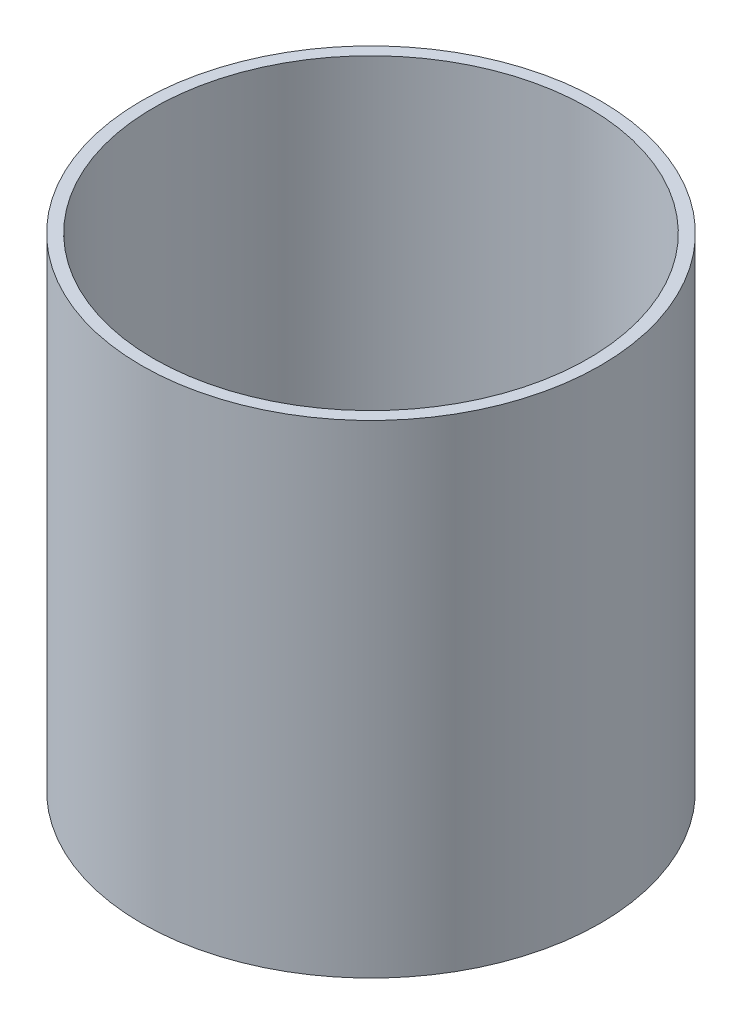
ISO-10303-21;
HEADER;
FILE_DESCRIPTION(('STEP AP214'),'2;1');
FILE_NAME('part.step','',(''),(''),'','','');
FILE_SCHEMA(('AUTOMOTIVE_DESIGN { 1 0 10303 214 1 1 1 1 }'));
ENDSEC;
DATA;
#1=APPLICATION_CONTEXT('core data for automotive mechanical design processes');
#2=APPLICATION_PROTOCOL_DEFINITION('international standard','automotive_design',2000,#1);
#3=PRODUCT_CONTEXT('',#1,'mechanical');
#4=PRODUCT('Part','Part','',(#3));
#5=PRODUCT_RELATED_PRODUCT_CATEGORY('part','',(#4));
#6=PRODUCT_DEFINITION_FORMATION('','',#4);
#7=PRODUCT_DEFINITION_CONTEXT('part definition',#1,'design');
#8=PRODUCT_DEFINITION('design','',#6,#7);
#9=PRODUCT_DEFINITION_SHAPE('','',#8);
#10=(LENGTH_UNIT() NAMED_UNIT(*) SI_UNIT(.MILLI.,.METRE.));
#11=(NAMED_UNIT(*) PLANE_ANGLE_UNIT() SI_UNIT($,.RADIAN.));
#12=(NAMED_UNIT(*) SI_UNIT($,.STERADIAN.) SOLID_ANGLE_UNIT());
#13=UNCERTAINTY_MEASURE_WITH_UNIT(LENGTH_MEASURE(1.E-05),#10,'distance_accuracy_value','');
#14=(GEOMETRIC_REPRESENTATION_CONTEXT(3) GLOBAL_UNCERTAINTY_ASSIGNED_CONTEXT((#13)) GLOBAL_UNIT_ASSIGNED_CONTEXT((#10,
#11,#12)) REPRESENTATION_CONTEXT('',''));
#15=CARTESIAN_POINT('',(0.,0.,0.));
#16=DIRECTION('',(0.,0.,1.));
#17=DIRECTION('',(1.,0.,0.));
#18=AXIS2_PLACEMENT_3D('',#15,#16,#17);
#19=CARTESIAN_POINT('',(0.,80.,0.));
#20=DIRECTION('',(0.,1.,0.));
#21=DIRECTION('',(0.,0.,1.));
#22=AXIS2_PLACEMENT_3D('',#19,#20,#21);
#23=PLANE('',#22);
#24=CARTESIAN_POINT('',(0.,80.,0.));
#25=DIRECTION('',(0.,1.,0.));
#26=DIRECTION('',(0.,0.,1.));
#27=AXIS2_PLACEMENT_3D('',#24,#25,#26);
#28=CIRCLE('',#27,38.);
#29=CARTESIAN_POINT('',(0.,80.,38.));
#30=VERTEX_POINT('',#29);
#31=EDGE_CURVE('E10',#30,#30,#28,.T.);
#32=ORIENTED_EDGE('',*,*,#31,.T.);
#33=EDGE_LOOP('',(#32));
#34=FACE_BOUND('',#33,.T.);
#35=CARTESIAN_POINT('',(0.,80.,0.));
#36=DIRECTION('',(0.,1.,0.));
#37=DIRECTION('',(0.,0.,1.));
#38=AXIS2_PLACEMENT_3D('',#35,#36,#37);
#39=CIRCLE('',#38,36.);
#40=CARTESIAN_POINT('',(0.,80.,36.));
#41=VERTEX_POINT('',#40);
#42=EDGE_CURVE('E45',#41,#41,#39,.T.);
#43=ORIENTED_EDGE('',*,*,#42,.F.);
#44=EDGE_LOOP('',(#43));
#45=FACE_BOUND('',#44,.T.);
#46=ADVANCED_FACE('F34',(#34,#45),#23,.T.);
#47=CARTESIAN_POINT('',(0.,0.,0.));
#48=DIRECTION('',(0.,1.,0.));
#49=DIRECTION('',(0.,0.,1.));
#50=AXIS2_PLACEMENT_3D('',#47,#48,#49);
#51=PLANE('',#50);
#52=CARTESIAN_POINT('',(0.,0.,0.));
#53=DIRECTION('',(0.,1.,0.));
#54=DIRECTION('',(0.,0.,1.));
#55=AXIS2_PLACEMENT_3D('',#52,#53,#54);
#56=CIRCLE('',#55,38.);
#57=CARTESIAN_POINT('',(0.,0.,38.));
#58=VERTEX_POINT('',#57);
#59=EDGE_CURVE('E38',#58,#58,#56,.T.);
#60=ORIENTED_EDGE('',*,*,#59,.F.);
#61=EDGE_LOOP('',(#60));
#62=FACE_BOUND('',#61,.T.);
#63=CARTESIAN_POINT('',(0.,0.,0.));
#64=DIRECTION('',(0.,1.,0.));
#65=DIRECTION('',(0.,0.,1.));
#66=AXIS2_PLACEMENT_3D('',#63,#64,#65);
#67=CIRCLE('',#66,36.);
#68=CARTESIAN_POINT('',(0.,0.,36.));
#69=VERTEX_POINT('',#68);
#70=EDGE_CURVE('E47',#69,#69,#67,.T.);
#71=ORIENTED_EDGE('',*,*,#70,.T.);
#72=EDGE_LOOP('',(#71));
#73=FACE_BOUND('',#72,.T.);
#74=ADVANCED_FACE('F57',(#62,#73),#51,.F.);
#75=CARTESIAN_POINT('',(0.,80.,0.));
#76=DIRECTION('',(0.,-1.,0.));
#77=DIRECTION('',(0.,0.,-1.));
#78=AXIS2_PLACEMENT_3D('',#75,#76,#77);
#79=CYLINDRICAL_SURFACE('',#78,38.);
#80=ORIENTED_EDGE('',*,*,#31,.F.);
#81=EDGE_LOOP('',(#80));
#82=FACE_BOUND('',#81,.T.);
#83=ORIENTED_EDGE('',*,*,#59,.T.);
#84=EDGE_LOOP('',(#83));
#85=FACE_BOUND('',#84,.T.);
#86=ADVANCED_FACE('F36',(#82,#85),#79,.T.);
#87=CARTESIAN_POINT('',(0.,80.,0.));
#88=DIRECTION('',(0.,-1.,0.));
#89=DIRECTION('',(0.,0.,-1.));
#90=AXIS2_PLACEMENT_3D('',#87,#88,#89);
#91=CYLINDRICAL_SURFACE('',#90,36.);
#92=ORIENTED_EDGE('',*,*,#42,.T.);
#93=EDGE_LOOP('',(#92));
#94=FACE_BOUND('',#93,.T.);
#95=ORIENTED_EDGE('',*,*,#70,.F.);
#96=EDGE_LOOP('',(#95));
#97=FACE_BOUND('',#96,.T.);
#98=ADVANCED_FACE('F53',(#94,#97),#91,.F.);
#99=CLOSED_SHELL('',(#46,#74,#86,#98));
#100=MANIFOLD_SOLID_BREP('B2',#99);
#101=ADVANCED_BREP_SHAPE_REPRESENTATION('',(#18,#100),#14);
#102=SHAPE_DEFINITION_REPRESENTATION(#9,#101);
ENDSEC;
END-ISO-10303-21;
